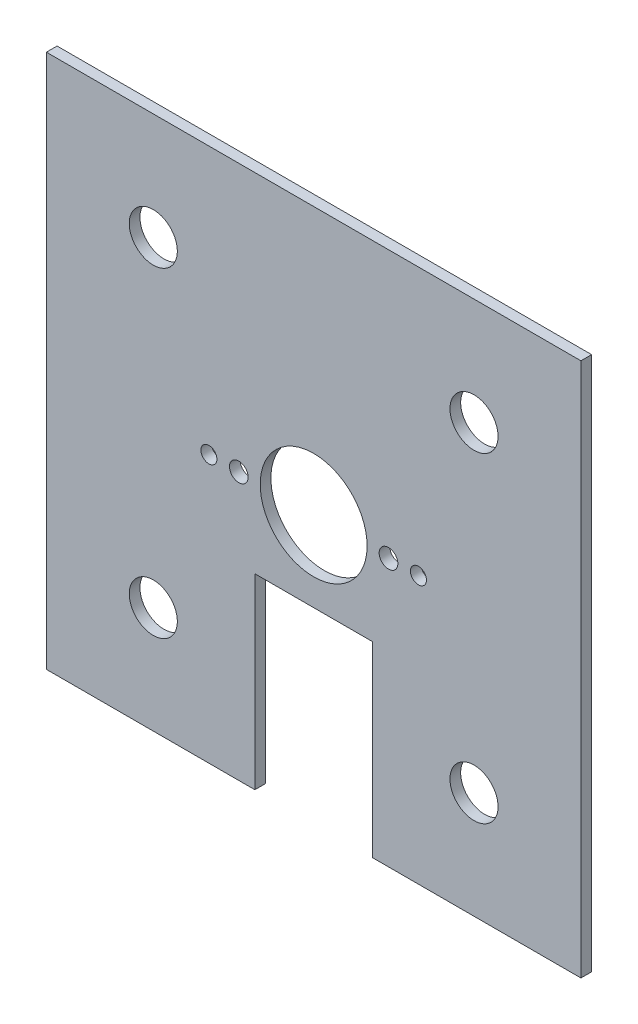
ISO-10303-21;
HEADER;
FILE_DESCRIPTION(('STEP AP214'),'2;1');
FILE_NAME('part.step','',(''),(''),'','','');
FILE_SCHEMA(('AUTOMOTIVE_DESIGN { 1 0 10303 214 1 1 1 1 }'));
ENDSEC;
DATA;
#1=APPLICATION_CONTEXT('core data for automotive mechanical design processes');
#2=APPLICATION_PROTOCOL_DEFINITION('international standard','automotive_design',2000,#1);
#3=PRODUCT_CONTEXT('',#1,'mechanical');
#4=PRODUCT('Part','Part','',(#3));
#5=PRODUCT_RELATED_PRODUCT_CATEGORY('part','',(#4));
#6=PRODUCT_DEFINITION_FORMATION('','',#4);
#7=PRODUCT_DEFINITION_CONTEXT('part definition',#1,'design');
#8=PRODUCT_DEFINITION('design','',#6,#7);
#9=PRODUCT_DEFINITION_SHAPE('','',#8);
#10=(LENGTH_UNIT() NAMED_UNIT(*) SI_UNIT(.MILLI.,.METRE.));
#11=(NAMED_UNIT(*) PLANE_ANGLE_UNIT() SI_UNIT($,.RADIAN.));
#12=(NAMED_UNIT(*) SI_UNIT($,.STERADIAN.) SOLID_ANGLE_UNIT());
#13=UNCERTAINTY_MEASURE_WITH_UNIT(LENGTH_MEASURE(1.E-05),#10,'distance_accuracy_value','');
#14=(GEOMETRIC_REPRESENTATION_CONTEXT(3) GLOBAL_UNCERTAINTY_ASSIGNED_CONTEXT((#13)) GLOBAL_UNIT_ASSIGNED_CONTEXT((#10,
#11,#12)) REPRESENTATION_CONTEXT('',''));
#15=CARTESIAN_POINT('',(0.,0.,0.));
#16=DIRECTION('',(0.,0.,1.));
#17=DIRECTION('',(1.,0.,0.));
#18=AXIS2_PLACEMENT_3D('',#15,#16,#17);
#19=CARTESIAN_POINT('',(5.5,0.,1.));
#20=DIRECTION('',(1.,0.,0.));
#21=DIRECTION('',(0.,1.,0.));
#22=AXIS2_PLACEMENT_3D('',#19,#20,#21);
#23=PLANE('',#22);
#24=DIRECTION('',(0.,-1.,0.));
#25=VECTOR('',#24,1.);
#26=CARTESIAN_POINT('',(5.5,0.,0.));
#27=LINE('',#26,#25);
#28=CARTESIAN_POINT('',(5.5,-7.5,0.));
#29=VERTEX_POINT('',#28);
#30=CARTESIAN_POINT('',(5.5,-25.,0.));
#31=VERTEX_POINT('',#30);
#32=EDGE_CURVE('E181',#29,#31,#27,.T.);
#33=ORIENTED_EDGE('',*,*,#32,.T.);
#34=DIRECTION('',(0.,0.,-1.));
#35=VECTOR('',#34,1.);
#36=CARTESIAN_POINT('',(5.5,-25.,1.));
#37=LINE('',#36,#35);
#38=CARTESIAN_POINT('',(5.5,-25.,1.));
#39=VERTEX_POINT('',#38);
#40=EDGE_CURVE('E11',#39,#31,#37,.T.);
#41=ORIENTED_EDGE('',*,*,#40,.F.);
#42=DIRECTION('',(0.,-1.,0.));
#43=VECTOR('',#42,1.);
#44=CARTESIAN_POINT('',(5.5,0.,1.));
#45=LINE('',#44,#43);
#46=CARTESIAN_POINT('',(5.5,-7.5,1.));
#47=VERTEX_POINT('',#46);
#48=EDGE_CURVE('E244',#47,#39,#45,.T.);
#49=ORIENTED_EDGE('',*,*,#48,.F.);
#50=DIRECTION('',(0.,0.,-1.));
#51=VECTOR('',#50,1.);
#52=CARTESIAN_POINT('',(5.5,-7.5,1.));
#53=LINE('',#52,#51);
#54=EDGE_CURVE('E141',#47,#29,#53,.T.);
#55=ORIENTED_EDGE('',*,*,#54,.T.);
#56=EDGE_LOOP('',(#33,#41,#49,#55));
#57=FACE_BOUND('',#56,.T.);
#58=ADVANCED_FACE('F44',(#57),#23,.F.);
#59=CARTESIAN_POINT('',(0.,-25.,1.));
#60=DIRECTION('',(0.,1.,0.));
#61=DIRECTION('',(0.,0.,1.));
#62=AXIS2_PLACEMENT_3D('',#59,#60,#61);
#63=PLANE('',#62);
#64=DIRECTION('',(1.,0.,0.));
#65=VECTOR('',#64,1.);
#66=CARTESIAN_POINT('',(0.,-25.,0.));
#67=LINE('',#66,#65);
#68=CARTESIAN_POINT('',(25.,-25.,0.));
#69=VERTEX_POINT('',#68);
#70=EDGE_CURVE('E185',#31,#69,#67,.T.);
#71=ORIENTED_EDGE('',*,*,#70,.T.);
#72=DIRECTION('',(0.,0.,-1.));
#73=VECTOR('',#72,1.);
#74=CARTESIAN_POINT('',(25.,-25.,1.));
#75=LINE('',#74,#73);
#76=CARTESIAN_POINT('',(25.,-25.,1.));
#77=VERTEX_POINT('',#76);
#78=EDGE_CURVE('E54',#77,#69,#75,.T.);
#79=ORIENTED_EDGE('',*,*,#78,.F.);
#80=DIRECTION('',(1.,0.,0.));
#81=VECTOR('',#80,1.);
#82=CARTESIAN_POINT('',(0.,-25.,1.));
#83=LINE('',#82,#81);
#84=EDGE_CURVE('E101',#39,#77,#83,.T.);
#85=ORIENTED_EDGE('',*,*,#84,.F.);
#86=ORIENTED_EDGE('',*,*,#40,.T.);
#87=EDGE_LOOP('',(#71,#79,#85,#86));
#88=FACE_BOUND('',#87,.T.);
#89=ADVANCED_FACE('F320',(#88),#63,.F.);
#90=CARTESIAN_POINT('',(25.,0.,1.));
#91=DIRECTION('',(-1.,0.,0.));
#92=DIRECTION('',(0.,0.,1.));
#93=AXIS2_PLACEMENT_3D('',#90,#91,#92);
#94=PLANE('',#93);
#95=DIRECTION('',(0.,1.,0.));
#96=VECTOR('',#95,1.);
#97=CARTESIAN_POINT('',(25.,0.,0.));
#98=LINE('',#97,#96);
#99=CARTESIAN_POINT('',(25.,25.,0.));
#100=VERTEX_POINT('',#99);
#101=EDGE_CURVE('E188',#69,#100,#98,.T.);
#102=ORIENTED_EDGE('',*,*,#101,.T.);
#103=DIRECTION('',(0.,0.,-1.));
#104=VECTOR('',#103,1.);
#105=CARTESIAN_POINT('',(25.,25.,1.));
#106=LINE('',#105,#104);
#107=CARTESIAN_POINT('',(25.,25.,1.));
#108=VERTEX_POINT('',#107);
#109=EDGE_CURVE('E217',#108,#100,#106,.T.);
#110=ORIENTED_EDGE('',*,*,#109,.F.);
#111=DIRECTION('',(0.,1.,0.));
#112=VECTOR('',#111,1.);
#113=CARTESIAN_POINT('',(25.,0.,1.));
#114=LINE('',#113,#112);
#115=EDGE_CURVE('E226',#77,#108,#114,.T.);
#116=ORIENTED_EDGE('',*,*,#115,.F.);
#117=ORIENTED_EDGE('',*,*,#78,.T.);
#118=EDGE_LOOP('',(#102,#110,#116,#117));
#119=FACE_BOUND('',#118,.T.);
#120=ADVANCED_FACE('F224',(#119),#94,.F.);
#121=CARTESIAN_POINT('',(0.,25.,1.));
#122=DIRECTION('',(0.,1.,0.));
#123=DIRECTION('',(0.,0.,1.));
#124=AXIS2_PLACEMENT_3D('',#121,#122,#123);
#125=PLANE('',#124);
#126=DIRECTION('',(1.,0.,0.));
#127=VECTOR('',#126,1.);
#128=CARTESIAN_POINT('',(0.,25.,0.));
#129=LINE('',#128,#127);
#130=CARTESIAN_POINT('',(-25.,25.,0.));
#131=VERTEX_POINT('',#130);
#132=EDGE_CURVE('E192',#131,#100,#129,.T.);
#133=ORIENTED_EDGE('',*,*,#132,.F.);
#134=DIRECTION('',(0.,0.,-1.));
#135=VECTOR('',#134,1.);
#136=CARTESIAN_POINT('',(-25.,25.,1.));
#137=LINE('',#136,#135);
#138=CARTESIAN_POINT('',(-25.,25.,1.));
#139=VERTEX_POINT('',#138);
#140=EDGE_CURVE('E214',#139,#131,#137,.T.);
#141=ORIENTED_EDGE('',*,*,#140,.F.);
#142=DIRECTION('',(1.,0.,0.));
#143=VECTOR('',#142,1.);
#144=CARTESIAN_POINT('',(0.,25.,1.));
#145=LINE('',#144,#143);
#146=EDGE_CURVE('E235',#139,#108,#145,.T.);
#147=ORIENTED_EDGE('',*,*,#146,.T.);
#148=ORIENTED_EDGE('',*,*,#109,.T.);
#149=EDGE_LOOP('',(#133,#141,#147,#148));
#150=FACE_BOUND('',#149,.T.);
#151=ADVANCED_FACE('F233',(#150),#125,.T.);
#152=CARTESIAN_POINT('',(-25.,0.,1.));
#153=DIRECTION('',(-1.,0.,0.));
#154=DIRECTION('',(0.,0.,1.));
#155=AXIS2_PLACEMENT_3D('',#152,#153,#154);
#156=PLANE('',#155);
#157=DIRECTION('',(0.,1.,0.));
#158=VECTOR('',#157,1.);
#159=CARTESIAN_POINT('',(-25.,0.,0.));
#160=LINE('',#159,#158);
#161=CARTESIAN_POINT('',(-25.,-25.,0.));
#162=VERTEX_POINT('',#161);
#163=EDGE_CURVE('E196',#162,#131,#160,.T.);
#164=ORIENTED_EDGE('',*,*,#163,.F.);
#165=DIRECTION('',(0.,0.,-1.));
#166=VECTOR('',#165,1.);
#167=CARTESIAN_POINT('',(-25.,-25.,1.));
#168=LINE('',#167,#166);
#169=CARTESIAN_POINT('',(-25.,-25.,1.));
#170=VERTEX_POINT('',#169);
#171=EDGE_CURVE('E135',#170,#162,#168,.T.);
#172=ORIENTED_EDGE('',*,*,#171,.F.);
#173=DIRECTION('',(0.,1.,0.));
#174=VECTOR('',#173,1.);
#175=CARTESIAN_POINT('',(-25.,0.,1.));
#176=LINE('',#175,#174);
#177=EDGE_CURVE('E122',#170,#139,#176,.T.);
#178=ORIENTED_EDGE('',*,*,#177,.T.);
#179=ORIENTED_EDGE('',*,*,#140,.T.);
#180=EDGE_LOOP('',(#164,#172,#178,#179));
#181=FACE_BOUND('',#180,.T.);
#182=ADVANCED_FACE('F387',(#181),#156,.T.);
#183=CARTESIAN_POINT('',(0.,-25.,1.));
#184=DIRECTION('',(0.,1.,0.));
#185=DIRECTION('',(0.,0.,1.));
#186=AXIS2_PLACEMENT_3D('',#183,#184,#185);
#187=PLANE('',#186);
#188=DIRECTION('',(1.,0.,0.));
#189=VECTOR('',#188,1.);
#190=CARTESIAN_POINT('',(0.,-25.,0.));
#191=LINE('',#190,#189);
#192=CARTESIAN_POINT('',(-5.5,-25.,0.));
#193=VERTEX_POINT('',#192);
#194=EDGE_CURVE('E130',#162,#193,#191,.T.);
#195=ORIENTED_EDGE('',*,*,#194,.T.);
#196=DIRECTION('',(0.,0.,-1.));
#197=VECTOR('',#196,1.);
#198=CARTESIAN_POINT('',(-5.5,-25.,1.));
#199=LINE('',#198,#197);
#200=CARTESIAN_POINT('',(-5.5,-25.,1.));
#201=VERTEX_POINT('',#200);
#202=EDGE_CURVE('E127',#201,#193,#199,.T.);
#203=ORIENTED_EDGE('',*,*,#202,.F.);
#204=DIRECTION('',(1.,0.,0.));
#205=VECTOR('',#204,1.);
#206=CARTESIAN_POINT('',(0.,-25.,1.));
#207=LINE('',#206,#205);
#208=EDGE_CURVE('E115',#170,#201,#207,.T.);
#209=ORIENTED_EDGE('',*,*,#208,.F.);
#210=ORIENTED_EDGE('',*,*,#171,.T.);
#211=EDGE_LOOP('',(#195,#203,#209,#210));
#212=FACE_BOUND('',#211,.T.);
#213=ADVANCED_FACE('F128',(#212),#187,.F.);
#214=CARTESIAN_POINT('',(-5.5,0.,1.));
#215=DIRECTION('',(1.,0.,0.));
#216=DIRECTION('',(0.,0.,-1.));
#217=AXIS2_PLACEMENT_3D('',#214,#215,#216);
#218=PLANE('',#217);
#219=DIRECTION('',(0.,-1.,0.));
#220=VECTOR('',#219,1.);
#221=CARTESIAN_POINT('',(-5.5,0.,0.));
#222=LINE('',#221,#220);
#223=CARTESIAN_POINT('',(-5.5,-7.5,0.));
#224=VERTEX_POINT('',#223);
#225=EDGE_CURVE('E202',#224,#193,#222,.T.);
#226=ORIENTED_EDGE('',*,*,#225,.F.);
#227=DIRECTION('',(0.,0.,-1.));
#228=VECTOR('',#227,1.);
#229=CARTESIAN_POINT('',(-5.5,-7.5,1.));
#230=LINE('',#229,#228);
#231=CARTESIAN_POINT('',(-5.5,-7.5,1.));
#232=VERTEX_POINT('',#231);
#233=EDGE_CURVE('E90',#232,#224,#230,.T.);
#234=ORIENTED_EDGE('',*,*,#233,.F.);
#235=DIRECTION('',(0.,-1.,0.));
#236=VECTOR('',#235,1.);
#237=CARTESIAN_POINT('',(-5.5,0.,1.));
#238=LINE('',#237,#236);
#239=EDGE_CURVE('E119',#232,#201,#238,.T.);
#240=ORIENTED_EDGE('',*,*,#239,.T.);
#241=ORIENTED_EDGE('',*,*,#202,.T.);
#242=EDGE_LOOP('',(#226,#234,#240,#241));
#243=FACE_BOUND('',#242,.T.);
#244=ADVANCED_FACE('F137',(#243),#218,.T.);
#245=CARTESIAN_POINT('',(-15.,15.,1.));
#246=DIRECTION('',(0.,0.,-1.));
#247=DIRECTION('',(-1.,0.,0.));
#248=AXIS2_PLACEMENT_3D('',#245,#246,#247);
#249=CYLINDRICAL_SURFACE('',#248,2.25);
#250=CARTESIAN_POINT('',(-15.,15.,1.));
#251=DIRECTION('',(0.,0.,1.));
#252=DIRECTION('',(1.,0.,0.));
#253=AXIS2_PLACEMENT_3D('',#250,#251,#252);
#254=CIRCLE('',#253,2.25);
#255=CARTESIAN_POINT('',(-12.75,15.,1.));
#256=VERTEX_POINT('',#255);
#257=EDGE_CURVE('E247',#256,#256,#254,.T.);
#258=ORIENTED_EDGE('',*,*,#257,.T.);
#259=EDGE_LOOP('',(#258));
#260=FACE_BOUND('',#259,.T.);
#261=CARTESIAN_POINT('',(-15.,15.,0.));
#262=DIRECTION('',(0.,0.,1.));
#263=DIRECTION('',(1.,0.,0.));
#264=AXIS2_PLACEMENT_3D('',#261,#262,#263);
#265=CIRCLE('',#264,2.25);
#266=CARTESIAN_POINT('',(-12.75,15.,0.));
#267=VERTEX_POINT('',#266);
#268=EDGE_CURVE('E177',#267,#267,#265,.T.);
#269=ORIENTED_EDGE('',*,*,#268,.F.);
#270=EDGE_LOOP('',(#269));
#271=FACE_BOUND('',#270,.T.);
#272=ADVANCED_FACE('F305',(#260,#271),#249,.F.);
#273=CARTESIAN_POINT('',(15.,15.,1.));
#274=DIRECTION('',(0.,0.,-1.));
#275=DIRECTION('',(-1.,0.,0.));
#276=AXIS2_PLACEMENT_3D('',#273,#274,#275);
#277=CYLINDRICAL_SURFACE('',#276,2.25);
#278=CARTESIAN_POINT('',(15.,15.,1.));
#279=DIRECTION('',(0.,0.,1.));
#280=DIRECTION('',(1.,0.,0.));
#281=AXIS2_PLACEMENT_3D('',#278,#279,#280);
#282=CIRCLE('',#281,2.25);
#283=CARTESIAN_POINT('',(17.25,15.,1.));
#284=VERTEX_POINT('',#283);
#285=EDGE_CURVE('E251',#284,#284,#282,.T.);
#286=ORIENTED_EDGE('',*,*,#285,.T.);
#287=EDGE_LOOP('',(#286));
#288=FACE_BOUND('',#287,.T.);
#289=CARTESIAN_POINT('',(15.,15.,0.));
#290=DIRECTION('',(0.,0.,1.));
#291=DIRECTION('',(1.,0.,0.));
#292=AXIS2_PLACEMENT_3D('',#289,#290,#291);
#293=CIRCLE('',#292,2.25);
#294=CARTESIAN_POINT('',(17.25,15.,0.));
#295=VERTEX_POINT('',#294);
#296=EDGE_CURVE('E173',#295,#295,#293,.T.);
#297=ORIENTED_EDGE('',*,*,#296,.F.);
#298=EDGE_LOOP('',(#297));
#299=FACE_BOUND('',#298,.T.);
#300=ADVANCED_FACE('F308',(#288,#299),#277,.F.);
#301=CARTESIAN_POINT('',(15.,-15.,1.));
#302=DIRECTION('',(0.,0.,-1.));
#303=DIRECTION('',(-1.,0.,0.));
#304=AXIS2_PLACEMENT_3D('',#301,#302,#303);
#305=CYLINDRICAL_SURFACE('',#304,2.25);
#306=CARTESIAN_POINT('',(15.,-15.,1.));
#307=DIRECTION('',(0.,0.,1.));
#308=DIRECTION('',(1.,0.,0.));
#309=AXIS2_PLACEMENT_3D('',#306,#307,#308);
#310=CIRCLE('',#309,2.25);
#311=CARTESIAN_POINT('',(17.25,-15.,1.));
#312=VERTEX_POINT('',#311);
#313=EDGE_CURVE('E255',#312,#312,#310,.T.);
#314=ORIENTED_EDGE('',*,*,#313,.T.);
#315=EDGE_LOOP('',(#314));
#316=FACE_BOUND('',#315,.T.);
#317=CARTESIAN_POINT('',(15.,-15.,0.));
#318=DIRECTION('',(0.,0.,1.));
#319=DIRECTION('',(1.,0.,0.));
#320=AXIS2_PLACEMENT_3D('',#317,#318,#319);
#321=CIRCLE('',#320,2.25);
#322=CARTESIAN_POINT('',(17.25,-15.,0.));
#323=VERTEX_POINT('',#322);
#324=EDGE_CURVE('E169',#323,#323,#321,.T.);
#325=ORIENTED_EDGE('',*,*,#324,.F.);
#326=EDGE_LOOP('',(#325));
#327=FACE_BOUND('',#326,.T.);
#328=ADVANCED_FACE('F331',(#316,#327),#305,.F.);
#329=CARTESIAN_POINT('',(-15.,-15.,1.));
#330=DIRECTION('',(0.,0.,-1.));
#331=DIRECTION('',(-1.,0.,0.));
#332=AXIS2_PLACEMENT_3D('',#329,#330,#331);
#333=CYLINDRICAL_SURFACE('',#332,2.25);
#334=CARTESIAN_POINT('',(-15.,-15.,1.));
#335=DIRECTION('',(0.,0.,1.));
#336=DIRECTION('',(1.,0.,0.));
#337=AXIS2_PLACEMENT_3D('',#334,#335,#336);
#338=CIRCLE('',#337,2.25);
#339=CARTESIAN_POINT('',(-12.75,-15.,1.));
#340=VERTEX_POINT('',#339);
#341=EDGE_CURVE('E259',#340,#340,#338,.T.);
#342=ORIENTED_EDGE('',*,*,#341,.T.);
#343=EDGE_LOOP('',(#342));
#344=FACE_BOUND('',#343,.T.);
#345=CARTESIAN_POINT('',(-15.,-15.,0.));
#346=DIRECTION('',(0.,0.,1.));
#347=DIRECTION('',(1.,0.,0.));
#348=AXIS2_PLACEMENT_3D('',#345,#346,#347);
#349=CIRCLE('',#348,2.25);
#350=CARTESIAN_POINT('',(-12.75,-15.,0.));
#351=VERTEX_POINT('',#350);
#352=EDGE_CURVE('E165',#351,#351,#349,.T.);
#353=ORIENTED_EDGE('',*,*,#352,.F.);
#354=EDGE_LOOP('',(#353));
#355=FACE_BOUND('',#354,.T.);
#356=ADVANCED_FACE('F335',(#344,#355),#333,.F.);
#357=CARTESIAN_POINT('',(0.,0.,1.));
#358=DIRECTION('',(0.,0.,-1.));
#359=DIRECTION('',(-1.,0.,0.));
#360=AXIS2_PLACEMENT_3D('',#357,#358,#359);
#361=CYLINDRICAL_SURFACE('',#360,5.);
#362=CARTESIAN_POINT('',(0.,0.,1.));
#363=DIRECTION('',(0.,0.,1.));
#364=DIRECTION('',(1.,0.,0.));
#365=AXIS2_PLACEMENT_3D('',#362,#363,#364);
#366=CIRCLE('',#365,5.);
#367=CARTESIAN_POINT('',(4.99999999999999,0.,1.));
#368=VERTEX_POINT('',#367);
#369=EDGE_CURVE('E263',#368,#368,#366,.T.);
#370=ORIENTED_EDGE('',*,*,#369,.T.);
#371=EDGE_LOOP('',(#370));
#372=FACE_BOUND('',#371,.T.);
#373=CARTESIAN_POINT('',(0.,0.,0.));
#374=DIRECTION('',(0.,0.,1.));
#375=DIRECTION('',(1.,0.,0.));
#376=AXIS2_PLACEMENT_3D('',#373,#374,#375);
#377=CIRCLE('',#376,5.);
#378=CARTESIAN_POINT('',(4.99999999999999,0.,0.));
#379=VERTEX_POINT('',#378);
#380=EDGE_CURVE('E161',#379,#379,#377,.T.);
#381=ORIENTED_EDGE('',*,*,#380,.F.);
#382=EDGE_LOOP('',(#381));
#383=FACE_BOUND('',#382,.T.);
#384=ADVANCED_FACE('F339',(#372,#383),#361,.F.);
#385=CARTESIAN_POINT('',(7.,0.,1.));
#386=DIRECTION('',(0.,0.,-1.));
#387=DIRECTION('',(-1.,0.,0.));
#388=AXIS2_PLACEMENT_3D('',#385,#386,#387);
#389=CYLINDRICAL_SURFACE('',#388,0.874999999999999);
#390=CARTESIAN_POINT('',(7.,0.,1.));
#391=DIRECTION('',(0.,0.,1.));
#392=DIRECTION('',(1.,0.,0.));
#393=AXIS2_PLACEMENT_3D('',#390,#391,#392);
#394=CIRCLE('',#393,0.874999999999999);
#395=CARTESIAN_POINT('',(7.875,0.,1.));
#396=VERTEX_POINT('',#395);
#397=EDGE_CURVE('E267',#396,#396,#394,.T.);
#398=ORIENTED_EDGE('',*,*,#397,.T.);
#399=EDGE_LOOP('',(#398));
#400=FACE_BOUND('',#399,.T.);
#401=CARTESIAN_POINT('',(7.,0.,0.));
#402=DIRECTION('',(0.,0.,1.));
#403=DIRECTION('',(1.,0.,0.));
#404=AXIS2_PLACEMENT_3D('',#401,#402,#403);
#405=CIRCLE('',#404,0.874999999999999);
#406=CARTESIAN_POINT('',(7.875,0.,0.));
#407=VERTEX_POINT('',#406);
#408=EDGE_CURVE('E157',#407,#407,#405,.T.);
#409=ORIENTED_EDGE('',*,*,#408,.F.);
#410=EDGE_LOOP('',(#409));
#411=FACE_BOUND('',#410,.T.);
#412=ADVANCED_FACE('F343',(#400,#411),#389,.F.);
#413=CARTESIAN_POINT('',(9.8,0.,1.));
#414=DIRECTION('',(0.,0.,-1.));
#415=DIRECTION('',(-1.,0.,0.));
#416=AXIS2_PLACEMENT_3D('',#413,#414,#415);
#417=CYLINDRICAL_SURFACE('',#416,0.750000000000002);
#418=CARTESIAN_POINT('',(9.8,0.,1.));
#419=DIRECTION('',(0.,0.,1.));
#420=DIRECTION('',(1.,0.,0.));
#421=AXIS2_PLACEMENT_3D('',#418,#419,#420);
#422=CIRCLE('',#421,0.750000000000002);
#423=CARTESIAN_POINT('',(10.55,0.,1.));
#424=VERTEX_POINT('',#423);
#425=EDGE_CURVE('E271',#424,#424,#422,.T.);
#426=ORIENTED_EDGE('',*,*,#425,.T.);
#427=EDGE_LOOP('',(#426));
#428=FACE_BOUND('',#427,.T.);
#429=CARTESIAN_POINT('',(9.8,0.,0.));
#430=DIRECTION('',(0.,0.,1.));
#431=DIRECTION('',(1.,0.,0.));
#432=AXIS2_PLACEMENT_3D('',#429,#430,#431);
#433=CIRCLE('',#432,0.750000000000002);
#434=CARTESIAN_POINT('',(10.55,0.,0.));
#435=VERTEX_POINT('',#434);
#436=EDGE_CURVE('E153',#435,#435,#433,.T.);
#437=ORIENTED_EDGE('',*,*,#436,.F.);
#438=EDGE_LOOP('',(#437));
#439=FACE_BOUND('',#438,.T.);
#440=ADVANCED_FACE('F347',(#428,#439),#417,.F.);
#441=CARTESIAN_POINT('',(-7.,0.,1.));
#442=DIRECTION('',(0.,0.,-1.));
#443=DIRECTION('',(-1.,0.,0.));
#444=AXIS2_PLACEMENT_3D('',#441,#442,#443);
#445=CYLINDRICAL_SURFACE('',#444,0.875);
#446=CARTESIAN_POINT('',(-7.,0.,1.));
#447=DIRECTION('',(0.,0.,1.));
#448=DIRECTION('',(1.,0.,0.));
#449=AXIS2_PLACEMENT_3D('',#446,#447,#448);
#450=CIRCLE('',#449,0.875);
#451=CARTESIAN_POINT('',(-6.125,0.,1.));
#452=VERTEX_POINT('',#451);
#453=EDGE_CURVE('E275',#452,#452,#450,.T.);
#454=ORIENTED_EDGE('',*,*,#453,.T.);
#455=EDGE_LOOP('',(#454));
#456=FACE_BOUND('',#455,.T.);
#457=CARTESIAN_POINT('',(-7.,0.,0.));
#458=DIRECTION('',(0.,0.,1.));
#459=DIRECTION('',(1.,0.,0.));
#460=AXIS2_PLACEMENT_3D('',#457,#458,#459);
#461=CIRCLE('',#460,0.875);
#462=CARTESIAN_POINT('',(-6.125,0.,0.));
#463=VERTEX_POINT('',#462);
#464=EDGE_CURVE('E149',#463,#463,#461,.T.);
#465=ORIENTED_EDGE('',*,*,#464,.F.);
#466=EDGE_LOOP('',(#465));
#467=FACE_BOUND('',#466,.T.);
#468=ADVANCED_FACE('F350',(#456,#467),#445,.F.);
#469=CARTESIAN_POINT('',(-9.8,0.,1.));
#470=DIRECTION('',(0.,0.,-1.));
#471=DIRECTION('',(-1.,0.,0.));
#472=AXIS2_PLACEMENT_3D('',#469,#470,#471);
#473=CYLINDRICAL_SURFACE('',#472,0.750000000000002);
#474=CARTESIAN_POINT('',(-9.8,0.,1.));
#475=DIRECTION('',(0.,0.,1.));
#476=DIRECTION('',(1.,0.,0.));
#477=AXIS2_PLACEMENT_3D('',#474,#475,#476);
#478=CIRCLE('',#477,0.750000000000002);
#479=CARTESIAN_POINT('',(-9.05,0.,1.));
#480=VERTEX_POINT('',#479);
#481=EDGE_CURVE('E207',#480,#480,#478,.T.);
#482=ORIENTED_EDGE('',*,*,#481,.T.);
#483=EDGE_LOOP('',(#482));
#484=FACE_BOUND('',#483,.T.);
#485=CARTESIAN_POINT('',(-9.8,0.,0.));
#486=DIRECTION('',(0.,0.,1.));
#487=DIRECTION('',(1.,0.,0.));
#488=AXIS2_PLACEMENT_3D('',#485,#486,#487);
#489=CIRCLE('',#488,0.750000000000002);
#490=CARTESIAN_POINT('',(-9.05,0.,0.));
#491=VERTEX_POINT('',#490);
#492=EDGE_CURVE('E145',#491,#491,#489,.T.);
#493=ORIENTED_EDGE('',*,*,#492,.F.);
#494=EDGE_LOOP('',(#493));
#495=FACE_BOUND('',#494,.T.);
#496=ADVANCED_FACE('F46',(#484,#495),#473,.F.);
#497=CARTESIAN_POINT('',(0.,-7.5,1.));
#498=DIRECTION('',(0.,1.,0.));
#499=DIRECTION('',(-1.,0.,0.));
#500=AXIS2_PLACEMENT_3D('',#497,#498,#499);
#501=PLANE('',#500);
#502=DIRECTION('',(1.,0.,0.));
#503=VECTOR('',#502,1.);
#504=CARTESIAN_POINT('',(0.,-7.5,0.));
#505=LINE('',#504,#503);
#506=EDGE_CURVE('E93',#224,#29,#505,.T.);
#507=ORIENTED_EDGE('',*,*,#506,.T.);
#508=ORIENTED_EDGE('',*,*,#54,.F.);
#509=DIRECTION('',(1.,0.,0.));
#510=VECTOR('',#509,1.);
#511=CARTESIAN_POINT('',(0.,-7.5,1.));
#512=LINE('',#511,#510);
#513=EDGE_CURVE('E62',#232,#47,#512,.T.);
#514=ORIENTED_EDGE('',*,*,#513,.F.);
#515=ORIENTED_EDGE('',*,*,#233,.T.);
#516=EDGE_LOOP('',(#507,#508,#514,#515));
#517=FACE_BOUND('',#516,.T.);
#518=ADVANCED_FACE('F287',(#517),#501,.F.);
#519=CARTESIAN_POINT('',(0.,0.,1.));
#520=DIRECTION('',(0.,0.,1.));
#521=DIRECTION('',(1.,0.,0.));
#522=AXIS2_PLACEMENT_3D('',#519,#520,#521);
#523=PLANE('',#522);
#524=ORIENTED_EDGE('',*,*,#481,.F.);
#525=EDGE_LOOP('',(#524));
#526=FACE_BOUND('',#525,.T.);
#527=ORIENTED_EDGE('',*,*,#453,.F.);
#528=EDGE_LOOP('',(#527));
#529=FACE_BOUND('',#528,.T.);
#530=ORIENTED_EDGE('',*,*,#425,.F.);
#531=EDGE_LOOP('',(#530));
#532=FACE_BOUND('',#531,.T.);
#533=ORIENTED_EDGE('',*,*,#397,.F.);
#534=EDGE_LOOP('',(#533));
#535=FACE_BOUND('',#534,.T.);
#536=ORIENTED_EDGE('',*,*,#369,.F.);
#537=EDGE_LOOP('',(#536));
#538=FACE_BOUND('',#537,.T.);
#539=ORIENTED_EDGE('',*,*,#341,.F.);
#540=EDGE_LOOP('',(#539));
#541=FACE_BOUND('',#540,.T.);
#542=ORIENTED_EDGE('',*,*,#313,.F.);
#543=EDGE_LOOP('',(#542));
#544=FACE_BOUND('',#543,.T.);
#545=ORIENTED_EDGE('',*,*,#285,.F.);
#546=EDGE_LOOP('',(#545));
#547=FACE_BOUND('',#546,.T.);
#548=ORIENTED_EDGE('',*,*,#257,.F.);
#549=EDGE_LOOP('',(#548));
#550=FACE_BOUND('',#549,.T.);
#551=ORIENTED_EDGE('',*,*,#48,.T.);
#552=ORIENTED_EDGE('',*,*,#84,.T.);
#553=ORIENTED_EDGE('',*,*,#115,.T.);
#554=ORIENTED_EDGE('',*,*,#146,.F.);
#555=ORIENTED_EDGE('',*,*,#177,.F.);
#556=ORIENTED_EDGE('',*,*,#208,.T.);
#557=ORIENTED_EDGE('',*,*,#239,.F.);
#558=ORIENTED_EDGE('',*,*,#513,.T.);
#559=EDGE_LOOP('',(#551,#552,#553,#554,#555,#556,#557,#558));
#560=FACE_BOUND('',#559,.T.);
#561=ADVANCED_FACE('F117',(#526,#529,#532,#535,#538,#541,#544,#547,#550,#560),#523,.T.);
#562=CARTESIAN_POINT('',(0.,0.,0.));
#563=DIRECTION('',(0.,0.,1.));
#564=DIRECTION('',(1.,0.,0.));
#565=AXIS2_PLACEMENT_3D('',#562,#563,#564);
#566=PLANE('',#565);
#567=ORIENTED_EDGE('',*,*,#492,.T.);
#568=EDGE_LOOP('',(#567));
#569=FACE_BOUND('',#568,.T.);
#570=ORIENTED_EDGE('',*,*,#464,.T.);
#571=EDGE_LOOP('',(#570));
#572=FACE_BOUND('',#571,.T.);
#573=ORIENTED_EDGE('',*,*,#436,.T.);
#574=EDGE_LOOP('',(#573));
#575=FACE_BOUND('',#574,.T.);
#576=ORIENTED_EDGE('',*,*,#408,.T.);
#577=EDGE_LOOP('',(#576));
#578=FACE_BOUND('',#577,.T.);
#579=ORIENTED_EDGE('',*,*,#380,.T.);
#580=EDGE_LOOP('',(#579));
#581=FACE_BOUND('',#580,.T.);
#582=ORIENTED_EDGE('',*,*,#352,.T.);
#583=EDGE_LOOP('',(#582));
#584=FACE_BOUND('',#583,.T.);
#585=ORIENTED_EDGE('',*,*,#324,.T.);
#586=EDGE_LOOP('',(#585));
#587=FACE_BOUND('',#586,.T.);
#588=ORIENTED_EDGE('',*,*,#296,.T.);
#589=EDGE_LOOP('',(#588));
#590=FACE_BOUND('',#589,.T.);
#591=ORIENTED_EDGE('',*,*,#268,.T.);
#592=EDGE_LOOP('',(#591));
#593=FACE_BOUND('',#592,.T.);
#594=ORIENTED_EDGE('',*,*,#32,.F.);
#595=ORIENTED_EDGE('',*,*,#506,.F.);
#596=ORIENTED_EDGE('',*,*,#225,.T.);
#597=ORIENTED_EDGE('',*,*,#194,.F.);
#598=ORIENTED_EDGE('',*,*,#163,.T.);
#599=ORIENTED_EDGE('',*,*,#132,.T.);
#600=ORIENTED_EDGE('',*,*,#101,.F.);
#601=ORIENTED_EDGE('',*,*,#70,.F.);
#602=EDGE_LOOP('',(#594,#595,#596,#597,#598,#599,#600,#601));
#603=FACE_BOUND('',#602,.T.);
#604=ADVANCED_FACE('F229',(#569,#572,#575,#578,#581,#584,#587,#590,#593,#603),#566,.F.);
#605=CLOSED_SHELL('',(#58,#89,#120,#151,#182,#213,#244,#272,#300,#328,#356,#384,#412,#440,#468,
#496,#518,#561,#604));
#606=MANIFOLD_SOLID_BREP('B2',#605);
#607=ADVANCED_BREP_SHAPE_REPRESENTATION('',(#18,#606),#14);
#608=SHAPE_DEFINITION_REPRESENTATION(#9,#607);
ENDSEC;
END-ISO-10303-21;
